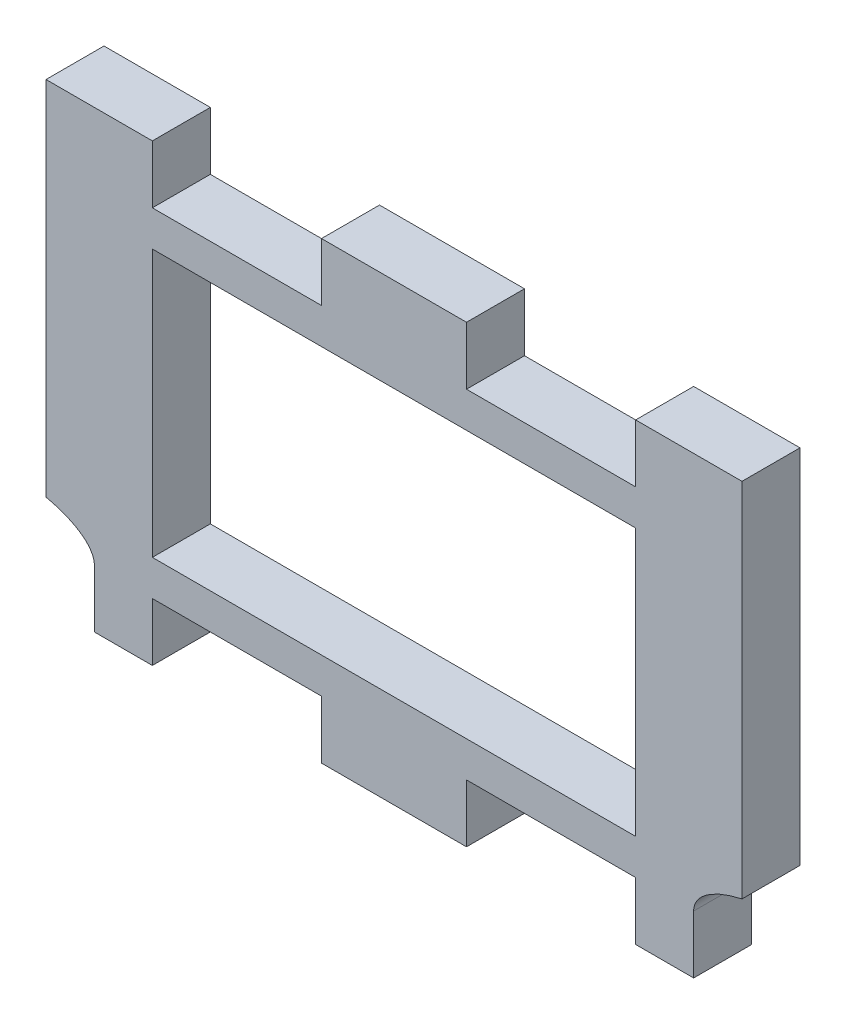
ISO-10303-21;
HEADER;
FILE_DESCRIPTION(('STEP AP214'),'2;1');
FILE_NAME('part.step','',(''),(''),'','','');
FILE_SCHEMA(('AUTOMOTIVE_DESIGN { 1 0 10303 214 1 1 1 1 }'));
ENDSEC;
DATA;
#1=APPLICATION_CONTEXT('core data for automotive mechanical design processes');
#2=APPLICATION_PROTOCOL_DEFINITION('international standard','automotive_design',2000,#1);
#3=PRODUCT_CONTEXT('',#1,'mechanical');
#4=PRODUCT('Part','Part','',(#3));
#5=PRODUCT_RELATED_PRODUCT_CATEGORY('part','',(#4));
#6=PRODUCT_DEFINITION_FORMATION('','',#4);
#7=PRODUCT_DEFINITION_CONTEXT('part definition',#1,'design');
#8=PRODUCT_DEFINITION('design','',#6,#7);
#9=PRODUCT_DEFINITION_SHAPE('','',#8);
#10=(LENGTH_UNIT() NAMED_UNIT(*) SI_UNIT(.MILLI.,.METRE.));
#11=(NAMED_UNIT(*) PLANE_ANGLE_UNIT() SI_UNIT($,.RADIAN.));
#12=(NAMED_UNIT(*) SI_UNIT($,.STERADIAN.) SOLID_ANGLE_UNIT());
#13=UNCERTAINTY_MEASURE_WITH_UNIT(LENGTH_MEASURE(1.E-05),#10,'distance_accuracy_value','');
#14=(GEOMETRIC_REPRESENTATION_CONTEXT(3) GLOBAL_UNCERTAINTY_ASSIGNED_CONTEXT((#13)) GLOBAL_UNIT_ASSIGNED_CONTEXT((#10,
#11,#12)) REPRESENTATION_CONTEXT('',''));
#15=CARTESIAN_POINT('',(0.,0.,0.));
#16=DIRECTION('',(0.,0.,1.));
#17=DIRECTION('',(1.,0.,0.));
#18=AXIS2_PLACEMENT_3D('',#15,#16,#17);
#19=CARTESIAN_POINT('',(0.,0.,6.));
#20=DIRECTION('',(0.,0.,1.));
#21=DIRECTION('',(1.,0.,0.));
#22=AXIS2_PLACEMENT_3D('',#19,#20,#21);
#23=PLANE('',#22);
#24=CARTESIAN_POINT('',(-80.,6.,6.));
#25=DIRECTION('',(0.,0.,1.));
#26=DIRECTION('',(1.,0.,0.));
#27=AXIS2_PLACEMENT_3D('',#24,#25,#26);
#28=ELLIPSE('',#27,8.99999999999999,4.);
#29=CARTESIAN_POINT('',(-71.,6.,6.));
#30=VERTEX_POINT('',#29);
#31=CARTESIAN_POINT('',(-76.,9.58322566591047,6.));
#32=VERTEX_POINT('',#31);
#33=EDGE_CURVE('E254',#30,#32,#28,.T.);
#34=ORIENTED_EDGE('',*,*,#33,.F.);
#35=DIRECTION('',(0.,-1.,0.));
#36=VECTOR('',#35,1.);
#37=CARTESIAN_POINT('',(-71.,0.,6.));
#38=LINE('',#37,#36);
#39=CARTESIAN_POINT('',(-71.,0.,6.));
#40=VERTEX_POINT('',#39);
#41=EDGE_CURVE('E258',#30,#40,#38,.T.);
#42=ORIENTED_EDGE('',*,*,#41,.T.);
#43=DIRECTION('',(-1.,0.,0.));
#44=VECTOR('',#43,1.);
#45=CARTESIAN_POINT('',(0.,0.,6.));
#46=LINE('',#45,#44);
#47=CARTESIAN_POINT('',(-65.,0.,6.));
#48=VERTEX_POINT('',#47);
#49=EDGE_CURVE('E261',#48,#40,#46,.T.);
#50=ORIENTED_EDGE('',*,*,#49,.F.);
#51=DIRECTION('',(0.,-1.,0.));
#52=VECTOR('',#51,1.);
#53=CARTESIAN_POINT('',(-65.,0.,6.));
#54=LINE('',#53,#52);
#55=CARTESIAN_POINT('',(-65.,6.,6.));
#56=VERTEX_POINT('',#55);
#57=EDGE_CURVE('E264',#56,#48,#54,.T.);
#58=ORIENTED_EDGE('',*,*,#57,.F.);
#59=DIRECTION('',(-1.,0.,0.));
#60=VECTOR('',#59,1.);
#61=CARTESIAN_POINT('',(0.,5.99999999999998,6.));
#62=LINE('',#61,#60);
#63=CARTESIAN_POINT('',(-47.5,5.99999999999999,6.));
#64=VERTEX_POINT('',#63);
#65=EDGE_CURVE('E269',#64,#56,#62,.T.);
#66=ORIENTED_EDGE('',*,*,#65,.F.);
#67=DIRECTION('',(0.,1.,0.));
#68=VECTOR('',#67,1.);
#69=CARTESIAN_POINT('',(-47.5,0.,6.));
#70=LINE('',#69,#68);
#71=CARTESIAN_POINT('',(-47.5,0.,6.));
#72=VERTEX_POINT('',#71);
#73=EDGE_CURVE('E272',#72,#64,#70,.T.);
#74=ORIENTED_EDGE('',*,*,#73,.F.);
#75=CARTESIAN_POINT('',(-32.5,0.,6.));
#76=VERTEX_POINT('',#75);
#77=EDGE_CURVE('E266',#76,#72,#46,.T.);
#78=ORIENTED_EDGE('',*,*,#77,.F.);
#79=DIRECTION('',(0.,-1.,0.));
#80=VECTOR('',#79,1.);
#81=CARTESIAN_POINT('',(-32.5,0.,6.));
#82=LINE('',#81,#80);
#83=CARTESIAN_POINT('',(-32.5,6.,6.));
#84=VERTEX_POINT('',#83);
#85=EDGE_CURVE('E275',#84,#76,#82,.T.);
#86=ORIENTED_EDGE('',*,*,#85,.F.);
#87=DIRECTION('',(-1.,0.,0.));
#88=VECTOR('',#87,1.);
#89=CARTESIAN_POINT('',(0.,6.,6.));
#90=LINE('',#89,#88);
#91=CARTESIAN_POINT('',(-15.,6.,6.));
#92=VERTEX_POINT('',#91);
#93=EDGE_CURVE('E278',#92,#84,#90,.T.);
#94=ORIENTED_EDGE('',*,*,#93,.F.);
#95=DIRECTION('',(0.,1.,0.));
#96=VECTOR('',#95,1.);
#97=CARTESIAN_POINT('',(-15.,0.,6.));
#98=LINE('',#97,#96);
#99=CARTESIAN_POINT('',(-15.,0.,6.));
#100=VERTEX_POINT('',#99);
#101=EDGE_CURVE('E281',#100,#92,#98,.T.);
#102=ORIENTED_EDGE('',*,*,#101,.F.);
#103=CARTESIAN_POINT('',(-9.,0.,6.));
#104=VERTEX_POINT('',#103);
#105=EDGE_CURVE('E265',#104,#100,#46,.T.);
#106=ORIENTED_EDGE('',*,*,#105,.F.);
#107=DIRECTION('',(0.,-1.,0.));
#108=VECTOR('',#107,1.);
#109=CARTESIAN_POINT('',(-9.,0.,6.));
#110=LINE('',#109,#108);
#111=CARTESIAN_POINT('',(-9.,6.,6.));
#112=VERTEX_POINT('',#111);
#113=EDGE_CURVE('E284',#112,#104,#110,.T.);
#114=ORIENTED_EDGE('',*,*,#113,.F.);
#115=CARTESIAN_POINT('',(0.,6.,6.));
#116=DIRECTION('',(0.,0.,1.));
#117=DIRECTION('',(-1.,0.,0.));
#118=AXIS2_PLACEMENT_3D('',#115,#116,#117);
#119=ELLIPSE('',#118,9.,4.);
#120=CARTESIAN_POINT('',(-4.,9.58322566591049,6.));
#121=VERTEX_POINT('',#120);
#122=EDGE_CURVE('E287',#121,#112,#119,.T.);
#123=ORIENTED_EDGE('',*,*,#122,.F.);
#124=DIRECTION('',(0.,-1.,0.));
#125=VECTOR('',#124,1.);
#126=CARTESIAN_POINT('',(-4.,0.,6.));
#127=LINE('',#126,#125);
#128=CARTESIAN_POINT('',(-4.,47.,6.));
#129=VERTEX_POINT('',#128);
#130=EDGE_CURVE('E291',#129,#121,#127,.T.);
#131=ORIENTED_EDGE('',*,*,#130,.F.);
#132=DIRECTION('',(-1.,0.,0.));
#133=VECTOR('',#132,1.);
#134=CARTESIAN_POINT('',(0.,47.,6.));
#135=LINE('',#134,#133);
#136=CARTESIAN_POINT('',(-15.,47.,6.));
#137=VERTEX_POINT('',#136);
#138=EDGE_CURVE('E537',#129,#137,#135,.T.);
#139=ORIENTED_EDGE('',*,*,#138,.T.);
#140=DIRECTION('',(0.,1.,0.));
#141=VECTOR('',#140,1.);
#142=CARTESIAN_POINT('',(-15.,0.,6.));
#143=LINE('',#142,#141);
#144=CARTESIAN_POINT('',(-15.,41.,6.));
#145=VERTEX_POINT('',#144);
#146=EDGE_CURVE('E554',#145,#137,#143,.T.);
#147=ORIENTED_EDGE('',*,*,#146,.F.);
#148=DIRECTION('',(1.,0.,0.));
#149=VECTOR('',#148,1.);
#150=CARTESIAN_POINT('',(0.,41.,6.));
#151=LINE('',#150,#149);
#152=CARTESIAN_POINT('',(-32.5,41.,6.));
#153=VERTEX_POINT('',#152);
#154=EDGE_CURVE('E557',#153,#145,#151,.T.);
#155=ORIENTED_EDGE('',*,*,#154,.F.);
#156=DIRECTION('',(0.,-1.,0.));
#157=VECTOR('',#156,1.);
#158=CARTESIAN_POINT('',(-32.5,0.,6.));
#159=LINE('',#158,#157);
#160=CARTESIAN_POINT('',(-32.5,47.,6.));
#161=VERTEX_POINT('',#160);
#162=EDGE_CURVE('E536',#161,#153,#159,.T.);
#163=ORIENTED_EDGE('',*,*,#162,.F.);
#164=CARTESIAN_POINT('',(-47.5,47.,6.));
#165=VERTEX_POINT('',#164);
#166=EDGE_CURVE('E532',#161,#165,#135,.T.);
#167=ORIENTED_EDGE('',*,*,#166,.T.);
#168=DIRECTION('',(0.,1.,0.));
#169=VECTOR('',#168,1.);
#170=CARTESIAN_POINT('',(-47.5,0.,6.));
#171=LINE('',#170,#169);
#172=CARTESIAN_POINT('',(-47.5,41.,6.));
#173=VERTEX_POINT('',#172);
#174=EDGE_CURVE('E528',#173,#165,#171,.T.);
#175=ORIENTED_EDGE('',*,*,#174,.F.);
#176=DIRECTION('',(1.,0.,0.));
#177=VECTOR('',#176,1.);
#178=CARTESIAN_POINT('',(0.,41.,6.));
#179=LINE('',#178,#177);
#180=CARTESIAN_POINT('',(-65.,41.,6.));
#181=VERTEX_POINT('',#180);
#182=EDGE_CURVE('E531',#181,#173,#179,.T.);
#183=ORIENTED_EDGE('',*,*,#182,.F.);
#184=DIRECTION('',(0.,-1.,0.));
#185=VECTOR('',#184,1.);
#186=CARTESIAN_POINT('',(-65.,0.,6.));
#187=LINE('',#186,#185);
#188=CARTESIAN_POINT('',(-65.,47.,6.));
#189=VERTEX_POINT('',#188);
#190=EDGE_CURVE('E534',#189,#181,#187,.T.);
#191=ORIENTED_EDGE('',*,*,#190,.F.);
#192=CARTESIAN_POINT('',(-76.,47.,6.));
#193=VERTEX_POINT('',#192);
#194=EDGE_CURVE('E538',#189,#193,#135,.T.);
#195=ORIENTED_EDGE('',*,*,#194,.T.);
#196=DIRECTION('',(0.,1.,0.));
#197=VECTOR('',#196,1.);
#198=CARTESIAN_POINT('',(-76.,0.,6.));
#199=LINE('',#198,#197);
#200=EDGE_CURVE('E435',#32,#193,#199,.T.);
#201=ORIENTED_EDGE('',*,*,#200,.F.);
#202=EDGE_LOOP('',(#34,#42,#50,#58,#66,#74,#78,#86,#94,#102,#106,#114,#123,#131,#139,#147,#155,
#163,#167,#175,#183,#191,#195,#201));
#203=FACE_BOUND('',#202,.T.);
#204=DIRECTION('',(1.,0.,0.));
#205=VECTOR('',#204,1.);
#206=CARTESIAN_POINT('',(0.,37.314631093011,6.));
#207=LINE('',#206,#205);
#208=CARTESIAN_POINT('',(-65.,37.314631093011,6.));
#209=VERTEX_POINT('',#208);
#210=CARTESIAN_POINT('',(-15.,37.314631093011,6.));
#211=VERTEX_POINT('',#210);
#212=EDGE_CURVE('E232',#209,#211,#207,.T.);
#213=ORIENTED_EDGE('',*,*,#212,.T.);
#214=DIRECTION('',(0.,1.,0.));
#215=VECTOR('',#214,1.);
#216=CARTESIAN_POINT('',(-15.,0.,6.));
#217=LINE('',#216,#215);
#218=CARTESIAN_POINT('',(-15.,9.68536890698897,6.));
#219=VERTEX_POINT('',#218);
#220=EDGE_CURVE('E228',#219,#211,#217,.T.);
#221=ORIENTED_EDGE('',*,*,#220,.F.);
#222=DIRECTION('',(1.,0.,0.));
#223=VECTOR('',#222,1.);
#224=CARTESIAN_POINT('',(0.,9.68536890698897,6.));
#225=LINE('',#224,#223);
#226=CARTESIAN_POINT('',(-65.,9.68536890698897,6.));
#227=VERTEX_POINT('',#226);
#228=EDGE_CURVE('E220',#227,#219,#225,.T.);
#229=ORIENTED_EDGE('',*,*,#228,.F.);
#230=DIRECTION('',(0.,1.,0.));
#231=VECTOR('',#230,1.);
#232=CARTESIAN_POINT('',(-65.,0.,6.));
#233=LINE('',#232,#231);
#234=EDGE_CURVE('E51',#227,#209,#233,.T.);
#235=ORIENTED_EDGE('',*,*,#234,.T.);
#236=EDGE_LOOP('',(#213,#221,#229,#235));
#237=FACE_BOUND('',#236,.T.);
#238=ADVANCED_FACE('F35',(#203,#237),#23,.T.);
#239=CARTESIAN_POINT('',(0.,0.,0.));
#240=DIRECTION('',(0.,0.,1.));
#241=DIRECTION('',(1.,0.,0.));
#242=AXIS2_PLACEMENT_3D('',#239,#240,#241);
#243=PLANE('',#242);
#244=CARTESIAN_POINT('',(-80.,6.,0.));
#245=DIRECTION('',(0.,0.,1.));
#246=DIRECTION('',(1.,0.,0.));
#247=AXIS2_PLACEMENT_3D('',#244,#245,#246);
#248=ELLIPSE('',#247,8.99999999999999,4.);
#249=CARTESIAN_POINT('',(-71.,6.,0.));
#250=VERTEX_POINT('',#249);
#251=CARTESIAN_POINT('',(-76.,9.58322566591047,0.));
#252=VERTEX_POINT('',#251);
#253=EDGE_CURVE('E251',#250,#252,#248,.T.);
#254=ORIENTED_EDGE('',*,*,#253,.T.);
#255=DIRECTION('',(0.,1.,0.));
#256=VECTOR('',#255,1.);
#257=CARTESIAN_POINT('',(-76.,0.,0.));
#258=LINE('',#257,#256);
#259=CARTESIAN_POINT('',(-76.,47.,0.));
#260=VERTEX_POINT('',#259);
#261=EDGE_CURVE('E259',#252,#260,#258,.T.);
#262=ORIENTED_EDGE('',*,*,#261,.T.);
#263=DIRECTION('',(-1.,0.,0.));
#264=VECTOR('',#263,1.);
#265=CARTESIAN_POINT('',(0.,47.,0.));
#266=LINE('',#265,#264);
#267=CARTESIAN_POINT('',(-65.,47.,0.));
#268=VERTEX_POINT('',#267);
#269=EDGE_CURVE('E429',#268,#260,#266,.T.);
#270=ORIENTED_EDGE('',*,*,#269,.F.);
#271=DIRECTION('',(0.,-1.,0.));
#272=VECTOR('',#271,1.);
#273=CARTESIAN_POINT('',(-65.,0.,0.));
#274=LINE('',#273,#272);
#275=CARTESIAN_POINT('',(-65.,41.,0.));
#276=VERTEX_POINT('',#275);
#277=EDGE_CURVE('E426',#268,#276,#274,.T.);
#278=ORIENTED_EDGE('',*,*,#277,.T.);
#279=DIRECTION('',(1.,0.,0.));
#280=VECTOR('',#279,1.);
#281=CARTESIAN_POINT('',(0.,41.,0.));
#282=LINE('',#281,#280);
#283=CARTESIAN_POINT('',(-47.5,41.,0.));
#284=VERTEX_POINT('',#283);
#285=EDGE_CURVE('E423',#276,#284,#282,.T.);
#286=ORIENTED_EDGE('',*,*,#285,.T.);
#287=DIRECTION('',(0.,1.,0.));
#288=VECTOR('',#287,1.);
#289=CARTESIAN_POINT('',(-47.5,0.,0.));
#290=LINE('',#289,#288);
#291=CARTESIAN_POINT('',(-47.5,47.,0.));
#292=VERTEX_POINT('',#291);
#293=EDGE_CURVE('E420',#284,#292,#290,.T.);
#294=ORIENTED_EDGE('',*,*,#293,.T.);
#295=CARTESIAN_POINT('',(-32.5,47.,0.));
#296=VERTEX_POINT('',#295);
#297=EDGE_CURVE('E416',#296,#292,#266,.T.);
#298=ORIENTED_EDGE('',*,*,#297,.F.);
#299=DIRECTION('',(0.,-1.,0.));
#300=VECTOR('',#299,1.);
#301=CARTESIAN_POINT('',(-32.5,0.,0.));
#302=LINE('',#301,#300);
#303=CARTESIAN_POINT('',(-32.5,41.,0.));
#304=VERTEX_POINT('',#303);
#305=EDGE_CURVE('E414',#296,#304,#302,.T.);
#306=ORIENTED_EDGE('',*,*,#305,.T.);
#307=DIRECTION('',(1.,0.,0.));
#308=VECTOR('',#307,1.);
#309=CARTESIAN_POINT('',(0.,41.,0.));
#310=LINE('',#309,#308);
#311=CARTESIAN_POINT('',(-15.,41.,0.));
#312=VERTEX_POINT('',#311);
#313=EDGE_CURVE('E405',#304,#312,#310,.T.);
#314=ORIENTED_EDGE('',*,*,#313,.T.);
#315=DIRECTION('',(0.,1.,0.));
#316=VECTOR('',#315,1.);
#317=CARTESIAN_POINT('',(-15.,0.,0.));
#318=LINE('',#317,#316);
#319=CARTESIAN_POINT('',(-15.,47.,0.));
#320=VERTEX_POINT('',#319);
#321=EDGE_CURVE('E396',#312,#320,#318,.T.);
#322=ORIENTED_EDGE('',*,*,#321,.T.);
#323=CARTESIAN_POINT('',(-4.,47.,0.));
#324=VERTEX_POINT('',#323);
#325=EDGE_CURVE('E406',#324,#320,#266,.T.);
#326=ORIENTED_EDGE('',*,*,#325,.F.);
#327=DIRECTION('',(0.,-1.,0.));
#328=VECTOR('',#327,1.);
#329=CARTESIAN_POINT('',(-4.,0.,0.));
#330=LINE('',#329,#328);
#331=CARTESIAN_POINT('',(-4.,9.58322566591049,0.));
#332=VERTEX_POINT('',#331);
#333=EDGE_CURVE('E517',#324,#332,#330,.T.);
#334=ORIENTED_EDGE('',*,*,#333,.T.);
#335=CARTESIAN_POINT('',(0.,6.,0.));
#336=DIRECTION('',(0.,0.,1.));
#337=DIRECTION('',(-1.,0.,0.));
#338=AXIS2_PLACEMENT_3D('',#335,#336,#337);
#339=ELLIPSE('',#338,9.,4.);
#340=CARTESIAN_POINT('',(-9.,6.,0.));
#341=VERTEX_POINT('',#340);
#342=EDGE_CURVE('E514',#332,#341,#339,.T.);
#343=ORIENTED_EDGE('',*,*,#342,.T.);
#344=DIRECTION('',(0.,-1.,0.));
#345=VECTOR('',#344,1.);
#346=CARTESIAN_POINT('',(-9.,0.,0.));
#347=LINE('',#346,#345);
#348=CARTESIAN_POINT('',(-9.,0.,0.));
#349=VERTEX_POINT('',#348);
#350=EDGE_CURVE('E494',#341,#349,#347,.T.);
#351=ORIENTED_EDGE('',*,*,#350,.T.);
#352=DIRECTION('',(-1.,0.,0.));
#353=VECTOR('',#352,1.);
#354=CARTESIAN_POINT('',(0.,0.,0.));
#355=LINE('',#354,#353);
#356=CARTESIAN_POINT('',(-15.,0.,0.));
#357=VERTEX_POINT('',#356);
#358=EDGE_CURVE('E489',#349,#357,#355,.T.);
#359=ORIENTED_EDGE('',*,*,#358,.T.);
#360=DIRECTION('',(0.,1.,0.));
#361=VECTOR('',#360,1.);
#362=CARTESIAN_POINT('',(-15.,0.,0.));
#363=LINE('',#362,#361);
#364=CARTESIAN_POINT('',(-15.,6.,0.));
#365=VERTEX_POINT('',#364);
#366=EDGE_CURVE('E495',#357,#365,#363,.T.);
#367=ORIENTED_EDGE('',*,*,#366,.T.);
#368=DIRECTION('',(-1.,0.,0.));
#369=VECTOR('',#368,1.);
#370=CARTESIAN_POINT('',(0.,6.,0.));
#371=LINE('',#370,#369);
#372=CARTESIAN_POINT('',(-32.5,6.,0.));
#373=VERTEX_POINT('',#372);
#374=EDGE_CURVE('E502',#365,#373,#371,.T.);
#375=ORIENTED_EDGE('',*,*,#374,.T.);
#376=DIRECTION('',(0.,-1.,0.));
#377=VECTOR('',#376,1.);
#378=CARTESIAN_POINT('',(-32.5,0.,0.));
#379=LINE('',#378,#377);
#380=CARTESIAN_POINT('',(-32.5,0.,0.));
#381=VERTEX_POINT('',#380);
#382=EDGE_CURVE('E497',#373,#381,#379,.T.);
#383=ORIENTED_EDGE('',*,*,#382,.T.);
#384=CARTESIAN_POINT('',(-47.5,0.,0.));
#385=VERTEX_POINT('',#384);
#386=EDGE_CURVE('E490',#381,#385,#355,.T.);
#387=ORIENTED_EDGE('',*,*,#386,.T.);
#388=DIRECTION('',(0.,1.,0.));
#389=VECTOR('',#388,1.);
#390=CARTESIAN_POINT('',(-47.5,0.,0.));
#391=LINE('',#390,#389);
#392=CARTESIAN_POINT('',(-47.5,5.99999999999999,0.));
#393=VERTEX_POINT('',#392);
#394=EDGE_CURVE('E498',#385,#393,#391,.T.);
#395=ORIENTED_EDGE('',*,*,#394,.T.);
#396=DIRECTION('',(-1.,0.,0.));
#397=VECTOR('',#396,1.);
#398=CARTESIAN_POINT('',(0.,5.99999999999998,0.));
#399=LINE('',#398,#397);
#400=CARTESIAN_POINT('',(-65.,6.,0.));
#401=VERTEX_POINT('',#400);
#402=EDGE_CURVE('E491',#393,#401,#399,.T.);
#403=ORIENTED_EDGE('',*,*,#402,.T.);
#404=DIRECTION('',(0.,-1.,0.));
#405=VECTOR('',#404,1.);
#406=CARTESIAN_POINT('',(-65.,0.,0.));
#407=LINE('',#406,#405);
#408=CARTESIAN_POINT('',(-65.,0.,0.));
#409=VERTEX_POINT('',#408);
#410=EDGE_CURVE('E487',#401,#409,#407,.T.);
#411=ORIENTED_EDGE('',*,*,#410,.T.);
#412=CARTESIAN_POINT('',(-71.,0.,0.));
#413=VERTEX_POINT('',#412);
#414=EDGE_CURVE('E477',#409,#413,#355,.T.);
#415=ORIENTED_EDGE('',*,*,#414,.T.);
#416=DIRECTION('',(0.,-1.,0.));
#417=VECTOR('',#416,1.);
#418=CARTESIAN_POINT('',(-71.,0.,0.));
#419=LINE('',#418,#417);
#420=EDGE_CURVE('E482',#250,#413,#419,.T.);
#421=ORIENTED_EDGE('',*,*,#420,.F.);
#422=EDGE_LOOP('',(#254,#262,#270,#278,#286,#294,#298,#306,#314,#322,#326,#334,#343,#351,#359,
#367,#375,#383,#387,#395,#403,#411,#415,#421));
#423=FACE_BOUND('',#422,.T.);
#424=DIRECTION('',(0.,1.,0.));
#425=VECTOR('',#424,1.);
#426=CARTESIAN_POINT('',(-15.,0.,0.));
#427=LINE('',#426,#425);
#428=CARTESIAN_POINT('',(-15.,9.68536890698897,0.));
#429=VERTEX_POINT('',#428);
#430=CARTESIAN_POINT('',(-15.,37.314631093011,0.));
#431=VERTEX_POINT('',#430);
#432=EDGE_CURVE('E59',#429,#431,#427,.T.);
#433=ORIENTED_EDGE('',*,*,#432,.T.);
#434=DIRECTION('',(1.,0.,0.));
#435=VECTOR('',#434,1.);
#436=CARTESIAN_POINT('',(0.,37.314631093011,0.));
#437=LINE('',#436,#435);
#438=CARTESIAN_POINT('',(-65.,37.314631093011,0.));
#439=VERTEX_POINT('',#438);
#440=EDGE_CURVE('E236',#439,#431,#437,.T.);
#441=ORIENTED_EDGE('',*,*,#440,.F.);
#442=DIRECTION('',(0.,1.,0.));
#443=VECTOR('',#442,1.);
#444=CARTESIAN_POINT('',(-65.,0.,0.));
#445=LINE('',#444,#443);
#446=CARTESIAN_POINT('',(-65.,9.68536890698897,0.));
#447=VERTEX_POINT('',#446);
#448=EDGE_CURVE('E239',#447,#439,#445,.T.);
#449=ORIENTED_EDGE('',*,*,#448,.F.);
#450=DIRECTION('',(1.,0.,0.));
#451=VECTOR('',#450,1.);
#452=CARTESIAN_POINT('',(0.,9.68536890698897,0.));
#453=LINE('',#452,#451);
#454=EDGE_CURVE('E245',#447,#429,#453,.T.);
#455=ORIENTED_EDGE('',*,*,#454,.T.);
#456=EDGE_LOOP('',(#433,#441,#449,#455));
#457=FACE_BOUND('',#456,.T.);
#458=ADVANCED_FACE('F342',(#423,#457),#243,.F.);
#459=DIRECTION('',(0.,0.,-1.));
#460=VECTOR('',#459,1.);
#461=SURFACE_OF_LINEAR_EXTRUSION('',#28,#460);
#462=ORIENTED_EDGE('',*,*,#253,.F.);
#463=DIRECTION('',(0.,0.,-1.));
#464=VECTOR('',#463,1.);
#465=CARTESIAN_POINT('',(-71.,6.,6.));
#466=LINE('',#465,#464);
#467=EDGE_CURVE('E11',#30,#250,#466,.T.);
#468=ORIENTED_EDGE('',*,*,#467,.F.);
#469=ORIENTED_EDGE('',*,*,#33,.T.);
#470=DIRECTION('',(0.,0.,-1.));
#471=VECTOR('',#470,1.);
#472=CARTESIAN_POINT('',(-76.,9.58322566591047,6.));
#473=LINE('',#472,#471);
#474=EDGE_CURVE('E432',#32,#252,#473,.T.);
#475=ORIENTED_EDGE('',*,*,#474,.T.);
#476=EDGE_LOOP('',(#462,#468,#469,#475));
#477=FACE_BOUND('',#476,.T.);
#478=ADVANCED_FACE('F37',(#477),#461,.T.);
#479=CARTESIAN_POINT('',(-71.,0.,6.));
#480=DIRECTION('',(1.,0.,0.));
#481=DIRECTION('',(0.,0.,-1.));
#482=AXIS2_PLACEMENT_3D('',#479,#480,#481);
#483=PLANE('',#482);
#484=ORIENTED_EDGE('',*,*,#420,.T.);
#485=DIRECTION('',(0.,0.,-1.));
#486=VECTOR('',#485,1.);
#487=CARTESIAN_POINT('',(-71.,0.,6.));
#488=LINE('',#487,#486);
#489=EDGE_CURVE('E44',#40,#413,#488,.T.);
#490=ORIENTED_EDGE('',*,*,#489,.F.);
#491=ORIENTED_EDGE('',*,*,#41,.F.);
#492=ORIENTED_EDGE('',*,*,#467,.T.);
#493=EDGE_LOOP('',(#484,#490,#491,#492));
#494=FACE_BOUND('',#493,.T.);
#495=ADVANCED_FACE('F334',(#494),#483,.F.);
#496=CARTESIAN_POINT('',(0.,0.,6.));
#497=DIRECTION('',(0.,-1.,0.));
#498=DIRECTION('',(1.,0.,0.));
#499=AXIS2_PLACEMENT_3D('',#496,#497,#498);
#500=PLANE('',#499);
#501=ORIENTED_EDGE('',*,*,#414,.F.);
#502=DIRECTION('',(0.,0.,-1.));
#503=VECTOR('',#502,1.);
#504=CARTESIAN_POINT('',(-65.,0.,6.));
#505=LINE('',#504,#503);
#506=EDGE_CURVE('E473',#48,#409,#505,.T.);
#507=ORIENTED_EDGE('',*,*,#506,.F.);
#508=ORIENTED_EDGE('',*,*,#49,.T.);
#509=ORIENTED_EDGE('',*,*,#489,.T.);
#510=EDGE_LOOP('',(#501,#507,#508,#509));
#511=FACE_BOUND('',#510,.T.);
#512=ADVANCED_FACE('F310',(#511),#500,.T.);
#513=CARTESIAN_POINT('',(-65.,0.,6.));
#514=DIRECTION('',(1.,0.,0.));
#515=DIRECTION('',(0.,0.,-1.));
#516=AXIS2_PLACEMENT_3D('',#513,#514,#515);
#517=PLANE('',#516);
#518=ORIENTED_EDGE('',*,*,#410,.F.);
#519=DIRECTION('',(0.,0.,-1.));
#520=VECTOR('',#519,1.);
#521=CARTESIAN_POINT('',(-65.,6.,6.));
#522=LINE('',#521,#520);
#523=EDGE_CURVE('E471',#56,#401,#522,.T.);
#524=ORIENTED_EDGE('',*,*,#523,.F.);
#525=ORIENTED_EDGE('',*,*,#57,.T.);
#526=ORIENTED_EDGE('',*,*,#506,.T.);
#527=EDGE_LOOP('',(#518,#524,#525,#526));
#528=FACE_BOUND('',#527,.T.);
#529=ADVANCED_FACE('F330',(#528),#517,.T.);
#530=CARTESIAN_POINT('',(0.,5.99999999999998,6.));
#531=DIRECTION('',(0.,-1.,0.));
#532=DIRECTION('',(1.,0.,0.));
#533=AXIS2_PLACEMENT_3D('',#530,#531,#532);
#534=PLANE('',#533);
#535=ORIENTED_EDGE('',*,*,#402,.F.);
#536=DIRECTION('',(0.,0.,-1.));
#537=VECTOR('',#536,1.);
#538=CARTESIAN_POINT('',(-47.5,5.99999999999999,6.));
#539=LINE('',#538,#537);
#540=EDGE_CURVE('E469',#64,#393,#539,.T.);
#541=ORIENTED_EDGE('',*,*,#540,.F.);
#542=ORIENTED_EDGE('',*,*,#65,.T.);
#543=ORIENTED_EDGE('',*,*,#523,.T.);
#544=EDGE_LOOP('',(#535,#541,#542,#543));
#545=FACE_BOUND('',#544,.T.);
#546=ADVANCED_FACE('F326',(#545),#534,.T.);
#547=CARTESIAN_POINT('',(-47.5,0.,6.));
#548=DIRECTION('',(-1.,0.,0.));
#549=DIRECTION('',(0.,0.,1.));
#550=AXIS2_PLACEMENT_3D('',#547,#548,#549);
#551=PLANE('',#550);
#552=ORIENTED_EDGE('',*,*,#394,.F.);
#553=DIRECTION('',(0.,0.,-1.));
#554=VECTOR('',#553,1.);
#555=CARTESIAN_POINT('',(-47.5,0.,6.));
#556=LINE('',#555,#554);
#557=EDGE_CURVE('E467',#72,#385,#556,.T.);
#558=ORIENTED_EDGE('',*,*,#557,.F.);
#559=ORIENTED_EDGE('',*,*,#73,.T.);
#560=ORIENTED_EDGE('',*,*,#540,.T.);
#561=EDGE_LOOP('',(#552,#558,#559,#560));
#562=FACE_BOUND('',#561,.T.);
#563=ADVANCED_FACE('F323',(#562),#551,.T.);
#564=ORIENTED_EDGE('',*,*,#386,.F.);
#565=DIRECTION('',(0.,0.,-1.));
#566=VECTOR('',#565,1.);
#567=CARTESIAN_POINT('',(-32.5,0.,6.));
#568=LINE('',#567,#566);
#569=EDGE_CURVE('E465',#76,#381,#568,.T.);
#570=ORIENTED_EDGE('',*,*,#569,.F.);
#571=ORIENTED_EDGE('',*,*,#77,.T.);
#572=ORIENTED_EDGE('',*,*,#557,.T.);
#573=EDGE_LOOP('',(#564,#570,#571,#572));
#574=FACE_BOUND('',#573,.T.);
#575=ADVANCED_FACE('F311',(#574),#500,.T.);
#576=CARTESIAN_POINT('',(-32.5,0.,6.));
#577=DIRECTION('',(1.,0.,0.));
#578=DIRECTION('',(0.,0.,-1.));
#579=AXIS2_PLACEMENT_3D('',#576,#577,#578);
#580=PLANE('',#579);
#581=ORIENTED_EDGE('',*,*,#382,.F.);
#582=DIRECTION('',(0.,0.,-1.));
#583=VECTOR('',#582,1.);
#584=CARTESIAN_POINT('',(-32.5,6.,6.));
#585=LINE('',#584,#583);
#586=EDGE_CURVE('E463',#84,#373,#585,.T.);
#587=ORIENTED_EDGE('',*,*,#586,.F.);
#588=ORIENTED_EDGE('',*,*,#85,.T.);
#589=ORIENTED_EDGE('',*,*,#569,.T.);
#590=EDGE_LOOP('',(#581,#587,#588,#589));
#591=FACE_BOUND('',#590,.T.);
#592=ADVANCED_FACE('F318',(#591),#580,.T.);
#593=CARTESIAN_POINT('',(0.,6.,6.));
#594=DIRECTION('',(0.,-1.,0.));
#595=DIRECTION('',(1.,0.,0.));
#596=AXIS2_PLACEMENT_3D('',#593,#594,#595);
#597=PLANE('',#596);
#598=ORIENTED_EDGE('',*,*,#374,.F.);
#599=DIRECTION('',(0.,0.,-1.));
#600=VECTOR('',#599,1.);
#601=CARTESIAN_POINT('',(-15.,6.,6.));
#602=LINE('',#601,#600);
#603=EDGE_CURVE('E461',#92,#365,#602,.T.);
#604=ORIENTED_EDGE('',*,*,#603,.F.);
#605=ORIENTED_EDGE('',*,*,#93,.T.);
#606=ORIENTED_EDGE('',*,*,#586,.T.);
#607=EDGE_LOOP('',(#598,#604,#605,#606));
#608=FACE_BOUND('',#607,.T.);
#609=ADVANCED_FACE('F314',(#608),#597,.T.);
#610=CARTESIAN_POINT('',(-15.,0.,6.));
#611=DIRECTION('',(-1.,0.,0.));
#612=DIRECTION('',(0.,-1.,0.));
#613=AXIS2_PLACEMENT_3D('',#610,#611,#612);
#614=PLANE('',#613);
#615=ORIENTED_EDGE('',*,*,#366,.F.);
#616=DIRECTION('',(0.,0.,-1.));
#617=VECTOR('',#616,1.);
#618=CARTESIAN_POINT('',(-15.,0.,6.));
#619=LINE('',#618,#617);
#620=EDGE_CURVE('E459',#100,#357,#619,.T.);
#621=ORIENTED_EDGE('',*,*,#620,.F.);
#622=ORIENTED_EDGE('',*,*,#101,.T.);
#623=ORIENTED_EDGE('',*,*,#603,.T.);
#624=EDGE_LOOP('',(#615,#621,#622,#623));
#625=FACE_BOUND('',#624,.T.);
#626=ADVANCED_FACE('F308',(#625),#614,.T.);
#627=ORIENTED_EDGE('',*,*,#358,.F.);
#628=DIRECTION('',(0.,0.,-1.));
#629=VECTOR('',#628,1.);
#630=CARTESIAN_POINT('',(-9.,0.,6.));
#631=LINE('',#630,#629);
#632=EDGE_CURVE('E457',#104,#349,#631,.T.);
#633=ORIENTED_EDGE('',*,*,#632,.F.);
#634=ORIENTED_EDGE('',*,*,#105,.T.);
#635=ORIENTED_EDGE('',*,*,#620,.T.);
#636=EDGE_LOOP('',(#627,#633,#634,#635));
#637=FACE_BOUND('',#636,.T.);
#638=ADVANCED_FACE('F304',(#637),#500,.T.);
#639=CARTESIAN_POINT('',(-9.,0.,6.));
#640=DIRECTION('',(1.,0.,0.));
#641=DIRECTION('',(0.,0.,-1.));
#642=AXIS2_PLACEMENT_3D('',#639,#640,#641);
#643=PLANE('',#642);
#644=ORIENTED_EDGE('',*,*,#350,.F.);
#645=DIRECTION('',(0.,0.,-1.));
#646=VECTOR('',#645,1.);
#647=CARTESIAN_POINT('',(-9.,6.,6.));
#648=LINE('',#647,#646);
#649=EDGE_CURVE('E455',#112,#341,#648,.T.);
#650=ORIENTED_EDGE('',*,*,#649,.F.);
#651=ORIENTED_EDGE('',*,*,#113,.T.);
#652=ORIENTED_EDGE('',*,*,#632,.T.);
#653=EDGE_LOOP('',(#644,#650,#651,#652));
#654=FACE_BOUND('',#653,.T.);
#655=ADVANCED_FACE('F299',(#654),#643,.T.);
#656=DIRECTION('',(0.,0.,-1.));
#657=VECTOR('',#656,1.);
#658=SURFACE_OF_LINEAR_EXTRUSION('',#119,#657);
#659=ORIENTED_EDGE('',*,*,#342,.F.);
#660=DIRECTION('',(0.,0.,-1.));
#661=VECTOR('',#660,1.);
#662=CARTESIAN_POINT('',(-4.,9.58322566591049,6.));
#663=LINE('',#662,#661);
#664=EDGE_CURVE('E453',#121,#332,#663,.T.);
#665=ORIENTED_EDGE('',*,*,#664,.F.);
#666=ORIENTED_EDGE('',*,*,#122,.T.);
#667=ORIENTED_EDGE('',*,*,#649,.T.);
#668=EDGE_LOOP('',(#659,#665,#666,#667));
#669=FACE_BOUND('',#668,.T.);
#670=ADVANCED_FACE('F294',(#669),#658,.T.);
#671=CARTESIAN_POINT('',(-4.,0.,6.));
#672=DIRECTION('',(1.,0.,0.));
#673=DIRECTION('',(0.,0.,-1.));
#674=AXIS2_PLACEMENT_3D('',#671,#672,#673);
#675=PLANE('',#674);
#676=ORIENTED_EDGE('',*,*,#333,.F.);
#677=DIRECTION('',(0.,0.,-1.));
#678=VECTOR('',#677,1.);
#679=CARTESIAN_POINT('',(-4.,47.,6.));
#680=LINE('',#679,#678);
#681=EDGE_CURVE('E451',#129,#324,#680,.T.);
#682=ORIENTED_EDGE('',*,*,#681,.F.);
#683=ORIENTED_EDGE('',*,*,#130,.T.);
#684=ORIENTED_EDGE('',*,*,#664,.T.);
#685=EDGE_LOOP('',(#676,#682,#683,#684));
#686=FACE_BOUND('',#685,.T.);
#687=ADVANCED_FACE('F298',(#686),#675,.T.);
#688=CARTESIAN_POINT('',(0.,47.,6.));
#689=DIRECTION('',(0.,-1.,0.));
#690=DIRECTION('',(0.,0.,-1.));
#691=AXIS2_PLACEMENT_3D('',#688,#689,#690);
#692=PLANE('',#691);
#693=ORIENTED_EDGE('',*,*,#325,.T.);
#694=DIRECTION('',(0.,0.,-1.));
#695=VECTOR('',#694,1.);
#696=CARTESIAN_POINT('',(-15.,47.,6.));
#697=LINE('',#696,#695);
#698=EDGE_CURVE('E402',#137,#320,#697,.T.);
#699=ORIENTED_EDGE('',*,*,#698,.F.);
#700=ORIENTED_EDGE('',*,*,#138,.F.);
#701=ORIENTED_EDGE('',*,*,#681,.T.);
#702=EDGE_LOOP('',(#693,#699,#700,#701));
#703=FACE_BOUND('',#702,.T.);
#704=ADVANCED_FACE('F367',(#703),#692,.F.);
#705=CARTESIAN_POINT('',(-15.,0.,6.));
#706=DIRECTION('',(-1.,0.,0.));
#707=DIRECTION('',(0.,0.,1.));
#708=AXIS2_PLACEMENT_3D('',#705,#706,#707);
#709=PLANE('',#708);
#710=ORIENTED_EDGE('',*,*,#321,.F.);
#711=DIRECTION('',(0.,0.,-1.));
#712=VECTOR('',#711,1.);
#713=CARTESIAN_POINT('',(-15.,41.,6.));
#714=LINE('',#713,#712);
#715=EDGE_CURVE('E399',#145,#312,#714,.T.);
#716=ORIENTED_EDGE('',*,*,#715,.F.);
#717=ORIENTED_EDGE('',*,*,#146,.T.);
#718=ORIENTED_EDGE('',*,*,#698,.T.);
#719=EDGE_LOOP('',(#710,#716,#717,#718));
#720=FACE_BOUND('',#719,.T.);
#721=ADVANCED_FACE('F386',(#720),#709,.T.);
#722=CARTESIAN_POINT('',(0.,41.,6.));
#723=DIRECTION('',(0.,1.,0.));
#724=DIRECTION('',(-1.,0.,0.));
#725=AXIS2_PLACEMENT_3D('',#722,#723,#724);
#726=PLANE('',#725);
#727=ORIENTED_EDGE('',*,*,#313,.F.);
#728=DIRECTION('',(0.,0.,-1.));
#729=VECTOR('',#728,1.);
#730=CARTESIAN_POINT('',(-32.5,41.,6.));
#731=LINE('',#730,#729);
#732=EDGE_CURVE('E447',#153,#304,#731,.T.);
#733=ORIENTED_EDGE('',*,*,#732,.F.);
#734=ORIENTED_EDGE('',*,*,#154,.T.);
#735=ORIENTED_EDGE('',*,*,#715,.T.);
#736=EDGE_LOOP('',(#727,#733,#734,#735));
#737=FACE_BOUND('',#736,.T.);
#738=ADVANCED_FACE('F383',(#737),#726,.T.);
#739=CARTESIAN_POINT('',(-32.5,0.,6.));
#740=DIRECTION('',(1.,0.,0.));
#741=DIRECTION('',(0.,0.,-1.));
#742=AXIS2_PLACEMENT_3D('',#739,#740,#741);
#743=PLANE('',#742);
#744=ORIENTED_EDGE('',*,*,#305,.F.);
#745=DIRECTION('',(0.,0.,-1.));
#746=VECTOR('',#745,1.);
#747=CARTESIAN_POINT('',(-32.5,47.,6.));
#748=LINE('',#747,#746);
#749=EDGE_CURVE('E445',#161,#296,#748,.T.);
#750=ORIENTED_EDGE('',*,*,#749,.F.);
#751=ORIENTED_EDGE('',*,*,#162,.T.);
#752=ORIENTED_EDGE('',*,*,#732,.T.);
#753=EDGE_LOOP('',(#744,#750,#751,#752));
#754=FACE_BOUND('',#753,.T.);
#755=ADVANCED_FACE('F380',(#754),#743,.T.);
#756=ORIENTED_EDGE('',*,*,#297,.T.);
#757=DIRECTION('',(0.,0.,-1.));
#758=VECTOR('',#757,1.);
#759=CARTESIAN_POINT('',(-47.5,47.,6.));
#760=LINE('',#759,#758);
#761=EDGE_CURVE('E443',#165,#292,#760,.T.);
#762=ORIENTED_EDGE('',*,*,#761,.F.);
#763=ORIENTED_EDGE('',*,*,#166,.F.);
#764=ORIENTED_EDGE('',*,*,#749,.T.);
#765=EDGE_LOOP('',(#756,#762,#763,#764));
#766=FACE_BOUND('',#765,.T.);
#767=ADVANCED_FACE('F368',(#766),#692,.F.);
#768=CARTESIAN_POINT('',(-47.5,0.,6.));
#769=DIRECTION('',(-1.,0.,0.));
#770=DIRECTION('',(0.,0.,1.));
#771=AXIS2_PLACEMENT_3D('',#768,#769,#770);
#772=PLANE('',#771);
#773=ORIENTED_EDGE('',*,*,#293,.F.);
#774=DIRECTION('',(0.,0.,-1.));
#775=VECTOR('',#774,1.);
#776=CARTESIAN_POINT('',(-47.5,41.,6.));
#777=LINE('',#776,#775);
#778=EDGE_CURVE('E441',#173,#284,#777,.T.);
#779=ORIENTED_EDGE('',*,*,#778,.F.);
#780=ORIENTED_EDGE('',*,*,#174,.T.);
#781=ORIENTED_EDGE('',*,*,#761,.T.);
#782=EDGE_LOOP('',(#773,#779,#780,#781));
#783=FACE_BOUND('',#782,.T.);
#784=ADVANCED_FACE('F375',(#783),#772,.T.);
#785=CARTESIAN_POINT('',(0.,41.,6.));
#786=DIRECTION('',(0.,1.,0.));
#787=DIRECTION('',(0.,0.,1.));
#788=AXIS2_PLACEMENT_3D('',#785,#786,#787);
#789=PLANE('',#788);
#790=ORIENTED_EDGE('',*,*,#285,.F.);
#791=DIRECTION('',(0.,0.,-1.));
#792=VECTOR('',#791,1.);
#793=CARTESIAN_POINT('',(-65.,41.,6.));
#794=LINE('',#793,#792);
#795=EDGE_CURVE('E439',#181,#276,#794,.T.);
#796=ORIENTED_EDGE('',*,*,#795,.F.);
#797=ORIENTED_EDGE('',*,*,#182,.T.);
#798=ORIENTED_EDGE('',*,*,#778,.T.);
#799=EDGE_LOOP('',(#790,#796,#797,#798));
#800=FACE_BOUND('',#799,.T.);
#801=ADVANCED_FACE('F371',(#800),#789,.T.);
#802=CARTESIAN_POINT('',(-65.,0.,6.));
#803=DIRECTION('',(1.,0.,0.));
#804=DIRECTION('',(0.,0.,-1.));
#805=AXIS2_PLACEMENT_3D('',#802,#803,#804);
#806=PLANE('',#805);
#807=ORIENTED_EDGE('',*,*,#277,.F.);
#808=DIRECTION('',(0.,0.,-1.));
#809=VECTOR('',#808,1.);
#810=CARTESIAN_POINT('',(-65.,47.,6.));
#811=LINE('',#810,#809);
#812=EDGE_CURVE('E437',#189,#268,#811,.T.);
#813=ORIENTED_EDGE('',*,*,#812,.F.);
#814=ORIENTED_EDGE('',*,*,#190,.T.);
#815=ORIENTED_EDGE('',*,*,#795,.T.);
#816=EDGE_LOOP('',(#807,#813,#814,#815));
#817=FACE_BOUND('',#816,.T.);
#818=ADVANCED_FACE('F365',(#817),#806,.T.);
#819=ORIENTED_EDGE('',*,*,#269,.T.);
#820=DIRECTION('',(0.,0.,-1.));
#821=VECTOR('',#820,1.);
#822=CARTESIAN_POINT('',(-76.,47.,6.));
#823=LINE('',#822,#821);
#824=EDGE_CURVE('E434',#193,#260,#823,.T.);
#825=ORIENTED_EDGE('',*,*,#824,.F.);
#826=ORIENTED_EDGE('',*,*,#194,.F.);
#827=ORIENTED_EDGE('',*,*,#812,.T.);
#828=EDGE_LOOP('',(#819,#825,#826,#827));
#829=FACE_BOUND('',#828,.T.);
#830=ADVANCED_FACE('F361',(#829),#692,.F.);
#831=CARTESIAN_POINT('',(-76.,0.,6.));
#832=DIRECTION('',(-1.,0.,0.));
#833=DIRECTION('',(0.,0.,1.));
#834=AXIS2_PLACEMENT_3D('',#831,#832,#833);
#835=PLANE('',#834);
#836=ORIENTED_EDGE('',*,*,#261,.F.);
#837=ORIENTED_EDGE('',*,*,#474,.F.);
#838=ORIENTED_EDGE('',*,*,#200,.T.);
#839=ORIENTED_EDGE('',*,*,#824,.T.);
#840=EDGE_LOOP('',(#836,#837,#838,#839));
#841=FACE_BOUND('',#840,.T.);
#842=ADVANCED_FACE('F358',(#841),#835,.T.);
#843=CARTESIAN_POINT('',(-15.,0.,6.));
#844=DIRECTION('',(-1.,0.,0.));
#845=DIRECTION('',(0.,0.,1.));
#846=AXIS2_PLACEMENT_3D('',#843,#844,#845);
#847=PLANE('',#846);
#848=ORIENTED_EDGE('',*,*,#432,.F.);
#849=DIRECTION('',(0.,0.,-1.));
#850=VECTOR('',#849,1.);
#851=CARTESIAN_POINT('',(-15.,9.68536890698897,6.));
#852=LINE('',#851,#850);
#853=EDGE_CURVE('E223',#219,#429,#852,.T.);
#854=ORIENTED_EDGE('',*,*,#853,.F.);
#855=ORIENTED_EDGE('',*,*,#220,.T.);
#856=DIRECTION('',(0.,0.,-1.));
#857=VECTOR('',#856,1.);
#858=CARTESIAN_POINT('',(-15.,37.314631093011,6.));
#859=LINE('',#858,#857);
#860=EDGE_CURVE('E249',#211,#431,#859,.T.);
#861=ORIENTED_EDGE('',*,*,#860,.T.);
#862=EDGE_LOOP('',(#848,#854,#855,#861));
#863=FACE_BOUND('',#862,.T.);
#864=ADVANCED_FACE('F230',(#863),#847,.T.);
#865=CARTESIAN_POINT('',(0.,37.314631093011,6.));
#866=DIRECTION('',(0.,1.,0.));
#867=DIRECTION('',(0.,0.,1.));
#868=AXIS2_PLACEMENT_3D('',#865,#866,#867);
#869=PLANE('',#868);
#870=ORIENTED_EDGE('',*,*,#440,.T.);
#871=ORIENTED_EDGE('',*,*,#860,.F.);
#872=ORIENTED_EDGE('',*,*,#212,.F.);
#873=DIRECTION('',(0.,0.,-1.));
#874=VECTOR('',#873,1.);
#875=CARTESIAN_POINT('',(-65.,37.314631093011,6.));
#876=LINE('',#875,#874);
#877=EDGE_CURVE('E252',#209,#439,#876,.T.);
#878=ORIENTED_EDGE('',*,*,#877,.T.);
#879=EDGE_LOOP('',(#870,#871,#872,#878));
#880=FACE_BOUND('',#879,.T.);
#881=ADVANCED_FACE('F694',(#880),#869,.F.);
#882=CARTESIAN_POINT('',(-65.,0.,6.));
#883=DIRECTION('',(-1.,0.,0.));
#884=DIRECTION('',(0.,0.,1.));
#885=AXIS2_PLACEMENT_3D('',#882,#883,#884);
#886=PLANE('',#885);
#887=ORIENTED_EDGE('',*,*,#448,.T.);
#888=ORIENTED_EDGE('',*,*,#877,.F.);
#889=ORIENTED_EDGE('',*,*,#234,.F.);
#890=DIRECTION('',(0.,0.,-1.));
#891=VECTOR('',#890,1.);
#892=CARTESIAN_POINT('',(-65.,9.68536890698897,6.));
#893=LINE('',#892,#891);
#894=EDGE_CURVE('E225',#227,#447,#893,.T.);
#895=ORIENTED_EDGE('',*,*,#894,.T.);
#896=EDGE_LOOP('',(#887,#888,#889,#895));
#897=FACE_BOUND('',#896,.T.);
#898=ADVANCED_FACE('F699',(#897),#886,.F.);
#899=CARTESIAN_POINT('',(0.,9.68536890698897,6.));
#900=DIRECTION('',(0.,1.,0.));
#901=DIRECTION('',(0.,0.,1.));
#902=AXIS2_PLACEMENT_3D('',#899,#900,#901);
#903=PLANE('',#902);
#904=ORIENTED_EDGE('',*,*,#454,.F.);
#905=ORIENTED_EDGE('',*,*,#894,.F.);
#906=ORIENTED_EDGE('',*,*,#228,.T.);
#907=ORIENTED_EDGE('',*,*,#853,.T.);
#908=EDGE_LOOP('',(#904,#905,#906,#907));
#909=FACE_BOUND('',#908,.T.);
#910=ADVANCED_FACE('F222',(#909),#903,.T.);
#911=CLOSED_SHELL('',(#238,#458,#478,#495,#512,#529,#546,#563,#575,#592,#609,#626,#638,#655,
#670,#687,#704,#721,#738,#755,#767,#784,#801,#818,#830,#842,#864,#881,#898,#910));
#912=MANIFOLD_SOLID_BREP('B2',#911);
#913=ADVANCED_BREP_SHAPE_REPRESENTATION('',(#18,#912),#14);
#914=SHAPE_DEFINITION_REPRESENTATION(#9,#913);
ENDSEC;
END-ISO-10303-21;
